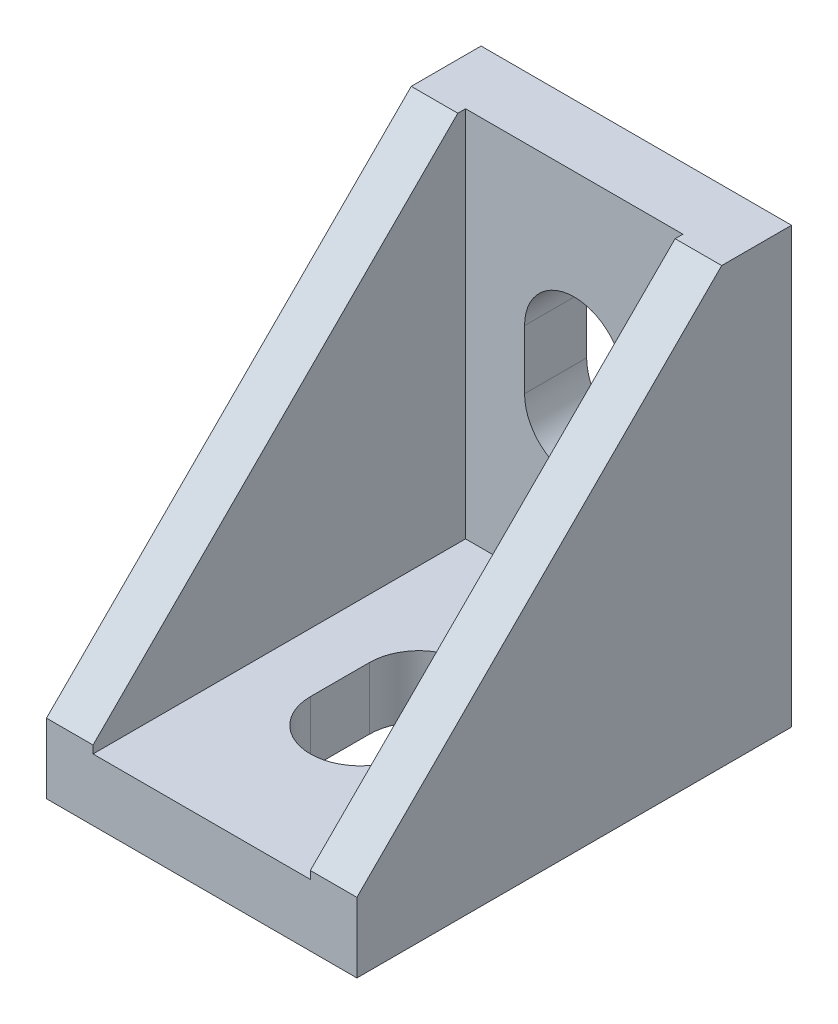
ISO-10303-21;
HEADER;
FILE_DESCRIPTION(('STEP AP214'),'2;1');
FILE_NAME('part.step','',(''),(''),'','','');
FILE_SCHEMA(('AUTOMOTIVE_DESIGN { 1 0 10303 214 1 1 1 1 }'));
ENDSEC;
DATA;
#1=APPLICATION_CONTEXT('core data for automotive mechanical design processes');
#2=APPLICATION_PROTOCOL_DEFINITION('international standard','automotive_design',2000,#1);
#3=PRODUCT_CONTEXT('',#1,'mechanical');
#4=PRODUCT('Part','Part','',(#3));
#5=PRODUCT_RELATED_PRODUCT_CATEGORY('part','',(#4));
#6=PRODUCT_DEFINITION_FORMATION('','',#4);
#7=PRODUCT_DEFINITION_CONTEXT('part definition',#1,'design');
#8=PRODUCT_DEFINITION('design','',#6,#7);
#9=PRODUCT_DEFINITION_SHAPE('','',#8);
#10=(LENGTH_UNIT() NAMED_UNIT(*) SI_UNIT(.MILLI.,.METRE.));
#11=(NAMED_UNIT(*) PLANE_ANGLE_UNIT() SI_UNIT($,.RADIAN.));
#12=(NAMED_UNIT(*) SI_UNIT($,.STERADIAN.) SOLID_ANGLE_UNIT());
#13=UNCERTAINTY_MEASURE_WITH_UNIT(LENGTH_MEASURE(1.E-05),#10,'distance_accuracy_value','');
#14=(GEOMETRIC_REPRESENTATION_CONTEXT(3) GLOBAL_UNCERTAINTY_ASSIGNED_CONTEXT((#13)) GLOBAL_UNIT_ASSIGNED_CONTEXT((#10,
#11,#12)) REPRESENTATION_CONTEXT('',''));
#15=CARTESIAN_POINT('',(0.,0.,0.));
#16=DIRECTION('',(0.,0.,1.));
#17=DIRECTION('',(1.,0.,0.));
#18=AXIS2_PLACEMENT_3D('',#15,#16,#17);
#19=CARTESIAN_POINT('',(10.,0.,28.));
#20=DIRECTION('',(0.,1.,0.));
#21=DIRECTION('',(0.,0.,1.));
#22=AXIS2_PLACEMENT_3D('',#19,#20,#21);
#23=PLANE('',#22);
#24=DIRECTION('',(0.,0.,-1.));
#25=VECTOR('',#24,1.);
#26=CARTESIAN_POINT('',(-10.,0.,28.));
#27=LINE('',#26,#25);
#28=CARTESIAN_POINT('',(-10.,0.,28.));
#29=VERTEX_POINT('',#28);
#30=CARTESIAN_POINT('',(-10.,0.,0.));
#31=VERTEX_POINT('',#30);
#32=EDGE_CURVE('E241',#29,#31,#27,.T.);
#33=ORIENTED_EDGE('',*,*,#32,.T.);
#34=DIRECTION('',(-1.,0.,0.));
#35=VECTOR('',#34,1.);
#36=CARTESIAN_POINT('',(10.,0.,0.));
#37=LINE('',#36,#35);
#38=CARTESIAN_POINT('',(10.,0.,0.));
#39=VERTEX_POINT('',#38);
#40=EDGE_CURVE('E257',#39,#31,#37,.T.);
#41=ORIENTED_EDGE('',*,*,#40,.F.);
#42=DIRECTION('',(0.,0.,-1.));
#43=VECTOR('',#42,1.);
#44=CARTESIAN_POINT('',(10.,0.,28.));
#45=LINE('',#44,#43);
#46=CARTESIAN_POINT('',(10.,0.,28.));
#47=VERTEX_POINT('',#46);
#48=EDGE_CURVE('E264',#47,#39,#45,.T.);
#49=ORIENTED_EDGE('',*,*,#48,.F.);
#50=DIRECTION('',(-1.,0.,0.));
#51=VECTOR('',#50,1.);
#52=CARTESIAN_POINT('',(10.,0.,28.));
#53=LINE('',#52,#51);
#54=EDGE_CURVE('E259',#47,#29,#53,.T.);
#55=ORIENTED_EDGE('',*,*,#54,.T.);
#56=EDGE_LOOP('',(#33,#41,#49,#55));
#57=FACE_BOUND('',#56,.T.);
#58=DIRECTION('',(-1.,0.,0.));
#59=VECTOR('',#58,1.);
#60=CARTESIAN_POINT('',(2.9,0.,4.5));
#61=LINE('',#60,#59);
#62=CARTESIAN_POINT('',(2.9,0.,4.5));
#63=VERTEX_POINT('',#62);
#64=CARTESIAN_POINT('',(-2.9,0.,4.5));
#65=VERTEX_POINT('',#64);
#66=EDGE_CURVE('E275',#63,#65,#61,.T.);
#67=ORIENTED_EDGE('',*,*,#66,.F.);
#68=DIRECTION('',(0.,0.,1.));
#69=VECTOR('',#68,1.);
#70=CARTESIAN_POINT('',(2.9,0.,3.));
#71=LINE('',#70,#69);
#72=CARTESIAN_POINT('',(2.9,0.,3.));
#73=VERTEX_POINT('',#72);
#74=EDGE_CURVE('E280',#73,#63,#71,.T.);
#75=ORIENTED_EDGE('',*,*,#74,.F.);
#76=DIRECTION('',(-1.,0.,0.));
#77=VECTOR('',#76,1.);
#78=CARTESIAN_POINT('',(2.9,0.,3.));
#79=LINE('',#78,#77);
#80=CARTESIAN_POINT('',(-2.9,0.,3.));
#81=VERTEX_POINT('',#80);
#82=EDGE_CURVE('E284',#73,#81,#79,.T.);
#83=ORIENTED_EDGE('',*,*,#82,.T.);
#84=DIRECTION('',(0.,0.,1.));
#85=VECTOR('',#84,1.);
#86=CARTESIAN_POINT('',(-2.9,0.,3.));
#87=LINE('',#86,#85);
#88=EDGE_CURVE('E289',#81,#65,#87,.T.);
#89=ORIENTED_EDGE('',*,*,#88,.T.);
#90=EDGE_LOOP('',(#67,#75,#83,#89));
#91=FACE_BOUND('',#90,.T.);
#92=DIRECTION('',(-1.,0.,0.));
#93=VECTOR('',#92,1.);
#94=CARTESIAN_POINT('',(2.9,0.,24.85));
#95=LINE('',#94,#93);
#96=CARTESIAN_POINT('',(2.9,0.,24.85));
#97=VERTEX_POINT('',#96);
#98=CARTESIAN_POINT('',(-2.9,0.,24.85));
#99=VERTEX_POINT('',#98);
#100=EDGE_CURVE('E294',#97,#99,#95,.T.);
#101=ORIENTED_EDGE('',*,*,#100,.F.);
#102=DIRECTION('',(0.,0.,1.));
#103=VECTOR('',#102,1.);
#104=CARTESIAN_POINT('',(2.9,0.,23.35));
#105=LINE('',#104,#103);
#106=CARTESIAN_POINT('',(2.9,0.,23.35));
#107=VERTEX_POINT('',#106);
#108=EDGE_CURVE('E299',#107,#97,#105,.T.);
#109=ORIENTED_EDGE('',*,*,#108,.F.);
#110=DIRECTION('',(-1.,0.,0.));
#111=VECTOR('',#110,1.);
#112=CARTESIAN_POINT('',(2.9,0.,23.35));
#113=LINE('',#112,#111);
#114=CARTESIAN_POINT('',(-2.9,0.,23.35));
#115=VERTEX_POINT('',#114);
#116=EDGE_CURVE('E303',#107,#115,#113,.T.);
#117=ORIENTED_EDGE('',*,*,#116,.T.);
#118=DIRECTION('',(0.,0.,1.));
#119=VECTOR('',#118,1.);
#120=CARTESIAN_POINT('',(-2.9,0.,23.35));
#121=LINE('',#120,#119);
#122=EDGE_CURVE('E308',#115,#99,#121,.T.);
#123=ORIENTED_EDGE('',*,*,#122,.T.);
#124=EDGE_LOOP('',(#101,#109,#117,#123));
#125=FACE_BOUND('',#124,.T.);
#126=CARTESIAN_POINT('',(0.,0.,14.));
#127=DIRECTION('',(0.,1.,0.));
#128=DIRECTION('',(1.,0.,0.));
#129=AXIS2_PLACEMENT_3D('',#126,#127,#128);
#130=CIRCLE('',#129,3.2);
#131=CARTESIAN_POINT('',(3.2,0.,14.));
#132=VERTEX_POINT('',#131);
#133=CARTESIAN_POINT('',(-3.2,0.,14.));
#134=VERTEX_POINT('',#133);
#135=EDGE_CURVE('E313',#132,#134,#130,.T.);
#136=ORIENTED_EDGE('',*,*,#135,.T.);
#137=DIRECTION('',(0.,0.,1.));
#138=VECTOR('',#137,1.);
#139=CARTESIAN_POINT('',(-3.2,0.,14.));
#140=LINE('',#139,#138);
#141=CARTESIAN_POINT('',(-3.2,0.,17.8));
#142=VERTEX_POINT('',#141);
#143=EDGE_CURVE('E318',#134,#142,#140,.T.);
#144=ORIENTED_EDGE('',*,*,#143,.T.);
#145=CARTESIAN_POINT('',(0.,0.,17.8));
#146=DIRECTION('',(0.,1.,0.));
#147=DIRECTION('',(-1.,0.,0.));
#148=AXIS2_PLACEMENT_3D('',#145,#146,#147);
#149=CIRCLE('',#148,3.2);
#150=CARTESIAN_POINT('',(3.2,0.,17.8));
#151=VERTEX_POINT('',#150);
#152=EDGE_CURVE('E323',#142,#151,#149,.T.);
#153=ORIENTED_EDGE('',*,*,#152,.T.);
#154=DIRECTION('',(0.,0.,-1.));
#155=VECTOR('',#154,1.);
#156=CARTESIAN_POINT('',(3.2,0.,17.8));
#157=LINE('',#156,#155);
#158=EDGE_CURVE('E328',#151,#132,#157,.T.);
#159=ORIENTED_EDGE('',*,*,#158,.T.);
#160=EDGE_LOOP('',(#136,#144,#153,#159));
#161=FACE_BOUND('',#160,.T.);
#162=ADVANCED_FACE('F17',(#57,#91,#125,#161),#23,.F.);
#163=CARTESIAN_POINT('',(7.,4.,28.));
#164=DIRECTION('',(0.,1.,0.));
#165=DIRECTION('',(0.,0.,1.));
#166=AXIS2_PLACEMENT_3D('',#163,#164,#165);
#167=PLANE('',#166);
#168=DIRECTION('',(0.,0.,-1.));
#169=VECTOR('',#168,1.);
#170=CARTESIAN_POINT('',(-7.,4.,28.));
#171=LINE('',#170,#169);
#172=CARTESIAN_POINT('',(-7.,4.,28.));
#173=VERTEX_POINT('',#172);
#174=CARTESIAN_POINT('',(-7.,4.,4.));
#175=VERTEX_POINT('',#174);
#176=EDGE_CURVE('E333',#173,#175,#171,.T.);
#177=ORIENTED_EDGE('',*,*,#176,.F.);
#178=DIRECTION('',(-1.,0.,0.));
#179=VECTOR('',#178,1.);
#180=CARTESIAN_POINT('',(7.,4.,28.));
#181=LINE('',#180,#179);
#182=CARTESIAN_POINT('',(7.,4.,28.));
#183=VERTEX_POINT('',#182);
#184=EDGE_CURVE('E338',#183,#173,#181,.T.);
#185=ORIENTED_EDGE('',*,*,#184,.F.);
#186=DIRECTION('',(0.,0.,-1.));
#187=VECTOR('',#186,1.);
#188=CARTESIAN_POINT('',(7.,4.,28.));
#189=LINE('',#188,#187);
#190=CARTESIAN_POINT('',(7.,4.,4.));
#191=VERTEX_POINT('',#190);
#192=EDGE_CURVE('E343',#183,#191,#189,.T.);
#193=ORIENTED_EDGE('',*,*,#192,.T.);
#194=DIRECTION('',(-1.,0.,0.));
#195=VECTOR('',#194,1.);
#196=CARTESIAN_POINT('',(7.,4.,4.));
#197=LINE('',#196,#195);
#198=EDGE_CURVE('E348',#191,#175,#197,.T.);
#199=ORIENTED_EDGE('',*,*,#198,.T.);
#200=EDGE_LOOP('',(#177,#185,#193,#199));
#201=FACE_BOUND('',#200,.T.);
#202=DIRECTION('',(0.,0.,1.));
#203=VECTOR('',#202,1.);
#204=CARTESIAN_POINT('',(-3.2,4.,14.));
#205=LINE('',#204,#203);
#206=CARTESIAN_POINT('',(-3.2,4.,14.));
#207=VERTEX_POINT('',#206);
#208=CARTESIAN_POINT('',(-3.2,4.,17.8));
#209=VERTEX_POINT('',#208);
#210=EDGE_CURVE('E353',#207,#209,#205,.T.);
#211=ORIENTED_EDGE('',*,*,#210,.F.);
#212=CARTESIAN_POINT('',(0.,4.,14.));
#213=DIRECTION('',(0.,1.,0.));
#214=DIRECTION('',(1.,0.,0.));
#215=AXIS2_PLACEMENT_3D('',#212,#213,#214);
#216=CIRCLE('',#215,3.2);
#217=CARTESIAN_POINT('',(3.2,4.,14.));
#218=VERTEX_POINT('',#217);
#219=EDGE_CURVE('E358',#218,#207,#216,.T.);
#220=ORIENTED_EDGE('',*,*,#219,.F.);
#221=DIRECTION('',(0.,0.,-1.));
#222=VECTOR('',#221,1.);
#223=CARTESIAN_POINT('',(3.2,4.,17.8));
#224=LINE('',#223,#222);
#225=CARTESIAN_POINT('',(3.2,4.,17.8));
#226=VERTEX_POINT('',#225);
#227=EDGE_CURVE('E363',#226,#218,#224,.T.);
#228=ORIENTED_EDGE('',*,*,#227,.F.);
#229=CARTESIAN_POINT('',(0.,4.,17.8));
#230=DIRECTION('',(0.,1.,0.));
#231=DIRECTION('',(-1.,0.,0.));
#232=AXIS2_PLACEMENT_3D('',#229,#230,#231);
#233=CIRCLE('',#232,3.2);
#234=EDGE_CURVE('E367',#209,#226,#233,.T.);
#235=ORIENTED_EDGE('',*,*,#234,.F.);
#236=EDGE_LOOP('',(#211,#220,#228,#235));
#237=FACE_BOUND('',#236,.T.);
#238=ADVANCED_FACE('F729',(#201,#237),#167,.T.);
#239=CARTESIAN_POINT('',(10.,28.,4.5));
#240=DIRECTION('',(0.,-0.707106781186548,-0.707106781186548));
#241=DIRECTION('',(0.,0.707106781186548,-0.707106781186548));
#242=AXIS2_PLACEMENT_3D('',#239,#240,#241);
#243=PLANE('',#242);
#244=DIRECTION('',(0.,-0.707106781186548,0.707106781186548));
#245=VECTOR('',#244,1.);
#246=CARTESIAN_POINT('',(-7.,28.,4.5));
#247=LINE('',#246,#245);
#248=CARTESIAN_POINT('',(-7.,28.,4.5));
#249=VERTEX_POINT('',#248);
#250=CARTESIAN_POINT('',(-7.,4.5,28.));
#251=VERTEX_POINT('',#250);
#252=EDGE_CURVE('E372',#249,#251,#247,.T.);
#253=ORIENTED_EDGE('',*,*,#252,.F.);
#254=DIRECTION('',(-1.,0.,0.));
#255=VECTOR('',#254,1.);
#256=CARTESIAN_POINT('',(-7.,28.,4.5));
#257=LINE('',#256,#255);
#258=CARTESIAN_POINT('',(-10.,28.,4.5));
#259=VERTEX_POINT('',#258);
#260=EDGE_CURVE('E376',#249,#259,#257,.T.);
#261=ORIENTED_EDGE('',*,*,#260,.T.);
#262=DIRECTION('',(0.,-0.707106781186548,0.707106781186548));
#263=VECTOR('',#262,1.);
#264=CARTESIAN_POINT('',(-10.,28.,4.5));
#265=LINE('',#264,#263);
#266=CARTESIAN_POINT('',(-10.,4.5,28.));
#267=VERTEX_POINT('',#266);
#268=EDGE_CURVE('E381',#259,#267,#265,.T.);
#269=ORIENTED_EDGE('',*,*,#268,.T.);
#270=DIRECTION('',(-1.,0.,0.));
#271=VECTOR('',#270,1.);
#272=CARTESIAN_POINT('',(-7.,4.5,28.));
#273=LINE('',#272,#271);
#274=EDGE_CURVE('E386',#251,#267,#273,.T.);
#275=ORIENTED_EDGE('',*,*,#274,.F.);
#276=EDGE_LOOP('',(#253,#261,#269,#275));
#277=FACE_BOUND('',#276,.T.);
#278=ADVANCED_FACE('F743',(#277),#243,.F.);
#279=DIRECTION('',(-1.,0.,0.));
#280=VECTOR('',#279,1.);
#281=CARTESIAN_POINT('',(10.,28.,4.5));
#282=LINE('',#281,#280);
#283=CARTESIAN_POINT('',(10.,28.,4.5));
#284=VERTEX_POINT('',#283);
#285=CARTESIAN_POINT('',(7.,28.,4.5));
#286=VERTEX_POINT('',#285);
#287=EDGE_CURVE('E391',#284,#286,#282,.T.);
#288=ORIENTED_EDGE('',*,*,#287,.T.);
#289=DIRECTION('',(0.,-0.707106781186548,0.707106781186548));
#290=VECTOR('',#289,1.);
#291=CARTESIAN_POINT('',(7.,28.,4.5));
#292=LINE('',#291,#290);
#293=CARTESIAN_POINT('',(7.,4.5,28.));
#294=VERTEX_POINT('',#293);
#295=EDGE_CURVE('E396',#286,#294,#292,.T.);
#296=ORIENTED_EDGE('',*,*,#295,.T.);
#297=DIRECTION('',(-1.,0.,0.));
#298=VECTOR('',#297,1.);
#299=CARTESIAN_POINT('',(10.,4.5,28.));
#300=LINE('',#299,#298);
#301=CARTESIAN_POINT('',(10.,4.5,28.));
#302=VERTEX_POINT('',#301);
#303=EDGE_CURVE('E401',#302,#294,#300,.T.);
#304=ORIENTED_EDGE('',*,*,#303,.F.);
#305=DIRECTION('',(0.,-0.707106781186548,0.707106781186548));
#306=VECTOR('',#305,1.);
#307=CARTESIAN_POINT('',(10.,28.,4.5));
#308=LINE('',#307,#306);
#309=EDGE_CURVE('E406',#284,#302,#308,.T.);
#310=ORIENTED_EDGE('',*,*,#309,.F.);
#311=EDGE_LOOP('',(#288,#296,#304,#310));
#312=FACE_BOUND('',#311,.T.);
#313=ADVANCED_FACE('F749',(#312),#243,.F.);
#314=CARTESIAN_POINT('',(10.,4.5,28.));
#315=DIRECTION('',(0.,0.,-1.));
#316=DIRECTION('',(-1.,0.,0.));
#317=AXIS2_PLACEMENT_3D('',#314,#315,#316);
#318=PLANE('',#317);
#319=ORIENTED_EDGE('',*,*,#303,.T.);
#320=DIRECTION('',(0.,-1.,0.));
#321=VECTOR('',#320,1.);
#322=CARTESIAN_POINT('',(7.,4.5,28.));
#323=LINE('',#322,#321);
#324=EDGE_CURVE('E410',#294,#183,#323,.T.);
#325=ORIENTED_EDGE('',*,*,#324,.T.);
#326=ORIENTED_EDGE('',*,*,#184,.T.);
#327=DIRECTION('',(0.,-1.,0.));
#328=VECTOR('',#327,1.);
#329=CARTESIAN_POINT('',(-7.,4.5,28.));
#330=LINE('',#329,#328);
#331=EDGE_CURVE('E415',#251,#173,#330,.T.);
#332=ORIENTED_EDGE('',*,*,#331,.F.);
#333=ORIENTED_EDGE('',*,*,#274,.T.);
#334=DIRECTION('',(0.,-1.,0.));
#335=VECTOR('',#334,1.);
#336=CARTESIAN_POINT('',(-10.,4.5,28.));
#337=LINE('',#336,#335);
#338=EDGE_CURVE('E419',#267,#29,#337,.T.);
#339=ORIENTED_EDGE('',*,*,#338,.T.);
#340=ORIENTED_EDGE('',*,*,#54,.F.);
#341=DIRECTION('',(0.,-1.,0.));
#342=VECTOR('',#341,1.);
#343=CARTESIAN_POINT('',(10.,4.5,28.));
#344=LINE('',#343,#342);
#345=EDGE_CURVE('E423',#302,#47,#344,.T.);
#346=ORIENTED_EDGE('',*,*,#345,.F.);
#347=EDGE_LOOP('',(#319,#325,#326,#332,#333,#339,#340,#346));
#348=FACE_BOUND('',#347,.T.);
#349=ADVANCED_FACE('F751',(#348),#318,.F.);
#350=CARTESIAN_POINT('',(10.,0.,0.));
#351=DIRECTION('',(0.,0.,1.));
#352=DIRECTION('',(1.,0.,0.));
#353=AXIS2_PLACEMENT_3D('',#350,#351,#352);
#354=PLANE('',#353);
#355=DIRECTION('',(0.,-1.,0.));
#356=VECTOR('',#355,1.);
#357=CARTESIAN_POINT('',(-3.2,17.8,0.));
#358=LINE('',#357,#356);
#359=CARTESIAN_POINT('',(-3.2,17.8,0.));
#360=VERTEX_POINT('',#359);
#361=CARTESIAN_POINT('',(-3.2,14.,0.));
#362=VERTEX_POINT('',#361);
#363=EDGE_CURVE('E427',#360,#362,#358,.T.);
#364=ORIENTED_EDGE('',*,*,#363,.T.);
#365=CARTESIAN_POINT('',(0.,14.,0.));
#366=DIRECTION('',(0.,0.,1.));
#367=DIRECTION('',(-1.,0.,0.));
#368=AXIS2_PLACEMENT_3D('',#365,#366,#367);
#369=CIRCLE('',#368,3.2);
#370=CARTESIAN_POINT('',(3.2,14.,0.));
#371=VERTEX_POINT('',#370);
#372=EDGE_CURVE('E432',#362,#371,#369,.T.);
#373=ORIENTED_EDGE('',*,*,#372,.T.);
#374=DIRECTION('',(0.,1.,0.));
#375=VECTOR('',#374,1.);
#376=CARTESIAN_POINT('',(3.2,14.,0.));
#377=LINE('',#376,#375);
#378=CARTESIAN_POINT('',(3.2,17.8,0.));
#379=VERTEX_POINT('',#378);
#380=EDGE_CURVE('E437',#371,#379,#377,.T.);
#381=ORIENTED_EDGE('',*,*,#380,.T.);
#382=CARTESIAN_POINT('',(0.,17.799999915706,0.));
#383=DIRECTION('',(0.,0.,1.));
#384=DIRECTION('',(1.,2.63418753476685E-08,0.));
#385=AXIS2_PLACEMENT_3D('',#382,#383,#384);
#386=CIRCLE('',#385,3.2);
#387=EDGE_CURVE('E442',#379,#360,#386,.T.);
#388=ORIENTED_EDGE('',*,*,#387,.T.);
#389=EDGE_LOOP('',(#364,#373,#381,#388));
#390=FACE_BOUND('',#389,.T.);
#391=DIRECTION('',(-1.,0.,0.));
#392=VECTOR('',#391,1.);
#393=CARTESIAN_POINT('',(2.9,23.35,0.));
#394=LINE('',#393,#392);
#395=CARTESIAN_POINT('',(2.9,23.35,0.));
#396=VERTEX_POINT('',#395);
#397=CARTESIAN_POINT('',(-2.9,23.35,0.));
#398=VERTEX_POINT('',#397);
#399=EDGE_CURVE('E447',#396,#398,#394,.T.);
#400=ORIENTED_EDGE('',*,*,#399,.F.);
#401=DIRECTION('',(0.,-1.,0.));
#402=VECTOR('',#401,1.);
#403=CARTESIAN_POINT('',(2.9,24.85,0.));
#404=LINE('',#403,#402);
#405=CARTESIAN_POINT('',(2.9,24.85,0.));
#406=VERTEX_POINT('',#405);
#407=EDGE_CURVE('E452',#406,#396,#404,.T.);
#408=ORIENTED_EDGE('',*,*,#407,.F.);
#409=DIRECTION('',(-1.,0.,0.));
#410=VECTOR('',#409,1.);
#411=CARTESIAN_POINT('',(2.9,24.85,0.));
#412=LINE('',#411,#410);
#413=CARTESIAN_POINT('',(-2.9,24.85,0.));
#414=VERTEX_POINT('',#413);
#415=EDGE_CURVE('E456',#406,#414,#412,.T.);
#416=ORIENTED_EDGE('',*,*,#415,.T.);
#417=DIRECTION('',(0.,-1.,0.));
#418=VECTOR('',#417,1.);
#419=CARTESIAN_POINT('',(-2.9,24.85,0.));
#420=LINE('',#419,#418);
#421=EDGE_CURVE('E461',#414,#398,#420,.T.);
#422=ORIENTED_EDGE('',*,*,#421,.T.);
#423=EDGE_LOOP('',(#400,#408,#416,#422));
#424=FACE_BOUND('',#423,.T.);
#425=DIRECTION('',(-1.,0.,0.));
#426=VECTOR('',#425,1.);
#427=CARTESIAN_POINT('',(2.9,3.,0.));
#428=LINE('',#427,#426);
#429=CARTESIAN_POINT('',(2.9,3.,0.));
#430=VERTEX_POINT('',#429);
#431=CARTESIAN_POINT('',(-2.9,3.,0.));
#432=VERTEX_POINT('',#431);
#433=EDGE_CURVE('E466',#430,#432,#428,.T.);
#434=ORIENTED_EDGE('',*,*,#433,.F.);
#435=DIRECTION('',(0.,-1.,0.));
#436=VECTOR('',#435,1.);
#437=CARTESIAN_POINT('',(2.9,4.5,0.));
#438=LINE('',#437,#436);
#439=CARTESIAN_POINT('',(2.9,4.5,0.));
#440=VERTEX_POINT('',#439);
#441=EDGE_CURVE('E471',#440,#430,#438,.T.);
#442=ORIENTED_EDGE('',*,*,#441,.F.);
#443=DIRECTION('',(-1.,0.,0.));
#444=VECTOR('',#443,1.);
#445=CARTESIAN_POINT('',(2.9,4.5,0.));
#446=LINE('',#445,#444);
#447=CARTESIAN_POINT('',(-2.9,4.5,0.));
#448=VERTEX_POINT('',#447);
#449=EDGE_CURVE('E475',#440,#448,#446,.T.);
#450=ORIENTED_EDGE('',*,*,#449,.T.);
#451=DIRECTION('',(0.,-1.,0.));
#452=VECTOR('',#451,1.);
#453=CARTESIAN_POINT('',(-2.9,4.5,0.));
#454=LINE('',#453,#452);
#455=EDGE_CURVE('E250',#448,#432,#454,.T.);
#456=ORIENTED_EDGE('',*,*,#455,.T.);
#457=EDGE_LOOP('',(#434,#442,#450,#456));
#458=FACE_BOUND('',#457,.T.);
#459=DIRECTION('',(0.,1.,0.));
#460=VECTOR('',#459,1.);
#461=CARTESIAN_POINT('',(-10.,0.,0.));
#462=LINE('',#461,#460);
#463=CARTESIAN_POINT('',(-10.,28.,0.));
#464=VERTEX_POINT('',#463);
#465=EDGE_CURVE('E238',#31,#464,#462,.T.);
#466=ORIENTED_EDGE('',*,*,#465,.T.);
#467=DIRECTION('',(-1.,0.,0.));
#468=VECTOR('',#467,1.);
#469=CARTESIAN_POINT('',(10.,28.,0.));
#470=LINE('',#469,#468);
#471=CARTESIAN_POINT('',(10.,28.,0.));
#472=VERTEX_POINT('',#471);
#473=EDGE_CURVE('E249',#472,#464,#470,.T.);
#474=ORIENTED_EDGE('',*,*,#473,.F.);
#475=DIRECTION('',(0.,1.,0.));
#476=VECTOR('',#475,1.);
#477=CARTESIAN_POINT('',(10.,0.,0.));
#478=LINE('',#477,#476);
#479=EDGE_CURVE('E263',#39,#472,#478,.T.);
#480=ORIENTED_EDGE('',*,*,#479,.F.);
#481=ORIENTED_EDGE('',*,*,#40,.T.);
#482=EDGE_LOOP('',(#466,#474,#480,#481));
#483=FACE_BOUND('',#482,.T.);
#484=ADVANCED_FACE('F262',(#390,#424,#458,#483),#354,.F.);
#485=CARTESIAN_POINT('',(10.,28.,0.));
#486=DIRECTION('',(0.,-1.,0.));
#487=DIRECTION('',(0.,0.,-1.));
#488=AXIS2_PLACEMENT_3D('',#485,#486,#487);
#489=PLANE('',#488);
#490=DIRECTION('',(-1.,0.,0.));
#491=VECTOR('',#490,1.);
#492=CARTESIAN_POINT('',(7.,28.,4.));
#493=LINE('',#492,#491);
#494=CARTESIAN_POINT('',(7.,28.,4.));
#495=VERTEX_POINT('',#494);
#496=CARTESIAN_POINT('',(-7.,28.,4.));
#497=VERTEX_POINT('',#496);
#498=EDGE_CURVE('E492',#495,#497,#493,.T.);
#499=ORIENTED_EDGE('',*,*,#498,.F.);
#500=DIRECTION('',(0.,0.,1.));
#501=VECTOR('',#500,1.);
#502=CARTESIAN_POINT('',(7.,28.,4.));
#503=LINE('',#502,#501);
#504=EDGE_CURVE('E496',#495,#286,#503,.T.);
#505=ORIENTED_EDGE('',*,*,#504,.T.);
#506=ORIENTED_EDGE('',*,*,#287,.F.);
#507=DIRECTION('',(0.,0.,1.));
#508=VECTOR('',#507,1.);
#509=CARTESIAN_POINT('',(10.,28.,0.));
#510=LINE('',#509,#508);
#511=EDGE_CURVE('E501',#472,#284,#510,.T.);
#512=ORIENTED_EDGE('',*,*,#511,.F.);
#513=ORIENTED_EDGE('',*,*,#473,.T.);
#514=DIRECTION('',(0.,0.,1.));
#515=VECTOR('',#514,1.);
#516=CARTESIAN_POINT('',(-10.,28.,0.));
#517=LINE('',#516,#515);
#518=EDGE_CURVE('E244',#464,#259,#517,.T.);
#519=ORIENTED_EDGE('',*,*,#518,.T.);
#520=ORIENTED_EDGE('',*,*,#260,.F.);
#521=DIRECTION('',(0.,0.,1.));
#522=VECTOR('',#521,1.);
#523=CARTESIAN_POINT('',(-7.,28.,4.));
#524=LINE('',#523,#522);
#525=EDGE_CURVE('E508',#497,#249,#524,.T.);
#526=ORIENTED_EDGE('',*,*,#525,.F.);
#527=EDGE_LOOP('',(#499,#505,#506,#512,#513,#519,#520,#526));
#528=FACE_BOUND('',#527,.T.);
#529=ADVANCED_FACE('F757',(#528),#489,.F.);
#530=CARTESIAN_POINT('',(10.,0.,0.));
#531=DIRECTION('',(1.,0.,0.));
#532=DIRECTION('',(0.,0.,-1.));
#533=AXIS2_PLACEMENT_3D('',#530,#531,#532);
#534=PLANE('',#533);
#535=ORIENTED_EDGE('',*,*,#309,.T.);
#536=ORIENTED_EDGE('',*,*,#345,.T.);
#537=ORIENTED_EDGE('',*,*,#48,.T.);
#538=ORIENTED_EDGE('',*,*,#479,.T.);
#539=ORIENTED_EDGE('',*,*,#511,.T.);
#540=EDGE_LOOP('',(#535,#536,#537,#538,#539));
#541=FACE_BOUND('',#540,.T.);
#542=ADVANCED_FACE('F761',(#541),#534,.T.);
#543=CARTESIAN_POINT('',(-10.,0.,0.));
#544=DIRECTION('',(1.,0.,0.));
#545=DIRECTION('',(0.,0.,-1.));
#546=AXIS2_PLACEMENT_3D('',#543,#544,#545);
#547=PLANE('',#546);
#548=ORIENTED_EDGE('',*,*,#268,.F.);
#549=ORIENTED_EDGE('',*,*,#518,.F.);
#550=ORIENTED_EDGE('',*,*,#465,.F.);
#551=ORIENTED_EDGE('',*,*,#32,.F.);
#552=ORIENTED_EDGE('',*,*,#338,.F.);
#553=EDGE_LOOP('',(#548,#549,#550,#551,#552));
#554=FACE_BOUND('',#553,.T.);
#555=ADVANCED_FACE('F240',(#554),#547,.F.);
#556=CARTESIAN_POINT('',(7.,0.,0.));
#557=DIRECTION('',(1.,0.,0.));
#558=DIRECTION('',(0.,0.,-1.));
#559=AXIS2_PLACEMENT_3D('',#556,#557,#558);
#560=PLANE('',#559);
#561=ORIENTED_EDGE('',*,*,#504,.F.);
#562=DIRECTION('',(0.,1.,0.));
#563=VECTOR('',#562,1.);
#564=CARTESIAN_POINT('',(7.,4.,4.));
#565=LINE('',#564,#563);
#566=EDGE_CURVE('E512',#191,#495,#565,.T.);
#567=ORIENTED_EDGE('',*,*,#566,.F.);
#568=ORIENTED_EDGE('',*,*,#192,.F.);
#569=ORIENTED_EDGE('',*,*,#324,.F.);
#570=ORIENTED_EDGE('',*,*,#295,.F.);
#571=EDGE_LOOP('',(#561,#567,#568,#569,#570));
#572=FACE_BOUND('',#571,.T.);
#573=ADVANCED_FACE('F768',(#572),#560,.F.);
#574=CARTESIAN_POINT('',(-7.,0.,0.));
#575=DIRECTION('',(1.,0.,0.));
#576=DIRECTION('',(0.,0.,-1.));
#577=AXIS2_PLACEMENT_3D('',#574,#575,#576);
#578=PLANE('',#577);
#579=ORIENTED_EDGE('',*,*,#252,.T.);
#580=ORIENTED_EDGE('',*,*,#331,.T.);
#581=ORIENTED_EDGE('',*,*,#176,.T.);
#582=DIRECTION('',(0.,1.,0.));
#583=VECTOR('',#582,1.);
#584=CARTESIAN_POINT('',(-7.,4.,4.));
#585=LINE('',#584,#583);
#586=EDGE_CURVE('E516',#175,#497,#585,.T.);
#587=ORIENTED_EDGE('',*,*,#586,.T.);
#588=ORIENTED_EDGE('',*,*,#525,.T.);
#589=EDGE_LOOP('',(#579,#580,#581,#587,#588));
#590=FACE_BOUND('',#589,.T.);
#591=ADVANCED_FACE('F771',(#590),#578,.T.);
#592=CARTESIAN_POINT('',(7.,4.,4.));
#593=DIRECTION('',(0.,0.,1.));
#594=DIRECTION('',(1.,0.,0.));
#595=AXIS2_PLACEMENT_3D('',#592,#593,#594);
#596=PLANE('',#595);
#597=CARTESIAN_POINT('',(0.,14.,4.));
#598=DIRECTION('',(0.,0.,1.));
#599=DIRECTION('',(-1.,0.,0.));
#600=AXIS2_PLACEMENT_3D('',#597,#598,#599);
#601=CIRCLE('',#600,3.2);
#602=CARTESIAN_POINT('',(-3.2,14.,4.));
#603=VERTEX_POINT('',#602);
#604=CARTESIAN_POINT('',(3.2,14.,4.));
#605=VERTEX_POINT('',#604);
#606=EDGE_CURVE('E521',#603,#605,#601,.T.);
#607=ORIENTED_EDGE('',*,*,#606,.F.);
#608=DIRECTION('',(0.,-1.,0.));
#609=VECTOR('',#608,1.);
#610=CARTESIAN_POINT('',(-3.2,17.8,4.));
#611=LINE('',#610,#609);
#612=CARTESIAN_POINT('',(-3.2,17.8,4.));
#613=VERTEX_POINT('',#612);
#614=EDGE_CURVE('E526',#613,#603,#611,.T.);
#615=ORIENTED_EDGE('',*,*,#614,.F.);
#616=CARTESIAN_POINT('',(0.,17.799999915706,4.));
#617=DIRECTION('',(0.,0.,1.));
#618=DIRECTION('',(1.,0.,0.));
#619=AXIS2_PLACEMENT_3D('',#616,#617,#618);
#620=CIRCLE('',#619,3.2);
#621=CARTESIAN_POINT('',(3.2,17.799999915706,4.));
#622=VERTEX_POINT('',#621);
#623=EDGE_CURVE('E531',#622,#613,#620,.T.);
#624=ORIENTED_EDGE('',*,*,#623,.F.);
#625=DIRECTION('',(0.,1.,0.));
#626=VECTOR('',#625,1.);
#627=CARTESIAN_POINT('',(3.2,14.,4.));
#628=LINE('',#627,#626);
#629=EDGE_CURVE('E535',#605,#622,#628,.T.);
#630=ORIENTED_EDGE('',*,*,#629,.F.);
#631=EDGE_LOOP('',(#607,#615,#624,#630));
#632=FACE_BOUND('',#631,.T.);
#633=ORIENTED_EDGE('',*,*,#586,.F.);
#634=ORIENTED_EDGE('',*,*,#198,.F.);
#635=ORIENTED_EDGE('',*,*,#566,.T.);
#636=ORIENTED_EDGE('',*,*,#498,.T.);
#637=EDGE_LOOP('',(#633,#634,#635,#636));
#638=FACE_BOUND('',#637,.T.);
#639=ADVANCED_FACE('F775',(#632,#638),#596,.T.);
#640=CARTESIAN_POINT('',(2.9,0.,4.5));
#641=DIRECTION('',(0.,0.,-1.));
#642=DIRECTION('',(-1.,0.,0.));
#643=AXIS2_PLACEMENT_3D('',#640,#641,#642);
#644=PLANE('',#643);
#645=DIRECTION('',(0.,-1.,0.));
#646=VECTOR('',#645,1.);
#647=CARTESIAN_POINT('',(-2.9,0.,4.5));
#648=LINE('',#647,#646);
#649=CARTESIAN_POINT('',(-2.9,-1.7,4.5));
#650=VERTEX_POINT('',#649);
#651=EDGE_CURVE('E540',#65,#650,#648,.T.);
#652=ORIENTED_EDGE('',*,*,#651,.T.);
#653=DIRECTION('',(-1.,0.,0.));
#654=VECTOR('',#653,1.);
#655=CARTESIAN_POINT('',(2.9,-1.7,4.5));
#656=LINE('',#655,#654);
#657=CARTESIAN_POINT('',(2.9,-1.7,4.5));
#658=VERTEX_POINT('',#657);
#659=EDGE_CURVE('E545',#658,#650,#656,.T.);
#660=ORIENTED_EDGE('',*,*,#659,.F.);
#661=DIRECTION('',(0.,-1.,0.));
#662=VECTOR('',#661,1.);
#663=CARTESIAN_POINT('',(2.9,0.,4.5));
#664=LINE('',#663,#662);
#665=EDGE_CURVE('E550',#63,#658,#664,.T.);
#666=ORIENTED_EDGE('',*,*,#665,.F.);
#667=ORIENTED_EDGE('',*,*,#66,.T.);
#668=EDGE_LOOP('',(#652,#660,#666,#667));
#669=FACE_BOUND('',#668,.T.);
#670=ADVANCED_FACE('F779',(#669),#644,.F.);
#671=CARTESIAN_POINT('',(2.9,-1.7,4.5));
#672=DIRECTION('',(0.,1.,0.));
#673=DIRECTION('',(0.,0.,1.));
#674=AXIS2_PLACEMENT_3D('',#671,#672,#673);
#675=PLANE('',#674);
#676=DIRECTION('',(0.,0.,-1.));
#677=VECTOR('',#676,1.);
#678=CARTESIAN_POINT('',(-2.9,-1.7,4.5));
#679=LINE('',#678,#677);
#680=CARTESIAN_POINT('',(-2.9,-1.7,3.));
#681=VERTEX_POINT('',#680);
#682=EDGE_CURVE('E554',#650,#681,#679,.T.);
#683=ORIENTED_EDGE('',*,*,#682,.T.);
#684=DIRECTION('',(-1.,0.,0.));
#685=VECTOR('',#684,1.);
#686=CARTESIAN_POINT('',(2.9,-1.7,3.));
#687=LINE('',#686,#685);
#688=CARTESIAN_POINT('',(2.9,-1.7,3.));
#689=VERTEX_POINT('',#688);
#690=EDGE_CURVE('E559',#689,#681,#687,.T.);
#691=ORIENTED_EDGE('',*,*,#690,.F.);
#692=DIRECTION('',(0.,0.,-1.));
#693=VECTOR('',#692,1.);
#694=CARTESIAN_POINT('',(2.9,-1.7,4.5));
#695=LINE('',#694,#693);
#696=EDGE_CURVE('E564',#658,#689,#695,.T.);
#697=ORIENTED_EDGE('',*,*,#696,.F.);
#698=ORIENTED_EDGE('',*,*,#659,.T.);
#699=EDGE_LOOP('',(#683,#691,#697,#698));
#700=FACE_BOUND('',#699,.T.);
#701=ADVANCED_FACE('F783',(#700),#675,.F.);
#702=CARTESIAN_POINT('',(2.9,-1.7,3.));
#703=DIRECTION('',(0.,0.,1.));
#704=DIRECTION('',(1.,0.,0.));
#705=AXIS2_PLACEMENT_3D('',#702,#703,#704);
#706=PLANE('',#705);
#707=DIRECTION('',(0.,1.,0.));
#708=VECTOR('',#707,1.);
#709=CARTESIAN_POINT('',(-2.9,-1.7,3.));
#710=LINE('',#709,#708);
#711=EDGE_CURVE('E568',#681,#81,#710,.T.);
#712=ORIENTED_EDGE('',*,*,#711,.T.);
#713=ORIENTED_EDGE('',*,*,#82,.F.);
#714=DIRECTION('',(0.,1.,0.));
#715=VECTOR('',#714,1.);
#716=CARTESIAN_POINT('',(2.9,-1.7,3.));
#717=LINE('',#716,#715);
#718=EDGE_CURVE('E573',#689,#73,#717,.T.);
#719=ORIENTED_EDGE('',*,*,#718,.F.);
#720=ORIENTED_EDGE('',*,*,#690,.T.);
#721=EDGE_LOOP('',(#712,#713,#719,#720));
#722=FACE_BOUND('',#721,.T.);
#723=ADVANCED_FACE('F787',(#722),#706,.F.);
#724=CARTESIAN_POINT('',(2.9,0.,0.));
#725=DIRECTION('',(1.,0.,0.));
#726=DIRECTION('',(0.,0.,-1.));
#727=AXIS2_PLACEMENT_3D('',#724,#725,#726);
#728=PLANE('',#727);
#729=ORIENTED_EDGE('',*,*,#74,.T.);
#730=ORIENTED_EDGE('',*,*,#665,.T.);
#731=ORIENTED_EDGE('',*,*,#696,.T.);
#732=ORIENTED_EDGE('',*,*,#718,.T.);
#733=EDGE_LOOP('',(#729,#730,#731,#732));
#734=FACE_BOUND('',#733,.T.);
#735=ADVANCED_FACE('F791',(#734),#728,.T.);
#736=CARTESIAN_POINT('',(-2.9,0.,0.));
#737=DIRECTION('',(1.,0.,0.));
#738=DIRECTION('',(0.,0.,-1.));
#739=AXIS2_PLACEMENT_3D('',#736,#737,#738);
#740=PLANE('',#739);
#741=ORIENTED_EDGE('',*,*,#88,.F.);
#742=ORIENTED_EDGE('',*,*,#711,.F.);
#743=ORIENTED_EDGE('',*,*,#682,.F.);
#744=ORIENTED_EDGE('',*,*,#651,.F.);
#745=EDGE_LOOP('',(#741,#742,#743,#744));
#746=FACE_BOUND('',#745,.T.);
#747=ADVANCED_FACE('F795',(#746),#740,.F.);
#748=CARTESIAN_POINT('',(2.9,0.,24.85));
#749=DIRECTION('',(0.,0.,-1.));
#750=DIRECTION('',(-1.,0.,0.));
#751=AXIS2_PLACEMENT_3D('',#748,#749,#750);
#752=PLANE('',#751);
#753=DIRECTION('',(0.,-1.,0.));
#754=VECTOR('',#753,1.);
#755=CARTESIAN_POINT('',(-2.9,0.,24.85));
#756=LINE('',#755,#754);
#757=CARTESIAN_POINT('',(-2.9,-1.7,24.85));
#758=VERTEX_POINT('',#757);
#759=EDGE_CURVE('E577',#99,#758,#756,.T.);
#760=ORIENTED_EDGE('',*,*,#759,.T.);
#761=DIRECTION('',(-1.,0.,0.));
#762=VECTOR('',#761,1.);
#763=CARTESIAN_POINT('',(2.9,-1.7,24.85));
#764=LINE('',#763,#762);
#765=CARTESIAN_POINT('',(2.9,-1.7,24.85));
#766=VERTEX_POINT('',#765);
#767=EDGE_CURVE('E582',#766,#758,#764,.T.);
#768=ORIENTED_EDGE('',*,*,#767,.F.);
#769=DIRECTION('',(0.,-1.,0.));
#770=VECTOR('',#769,1.);
#771=CARTESIAN_POINT('',(2.9,0.,24.85));
#772=LINE('',#771,#770);
#773=EDGE_CURVE('E587',#97,#766,#772,.T.);
#774=ORIENTED_EDGE('',*,*,#773,.F.);
#775=ORIENTED_EDGE('',*,*,#100,.T.);
#776=EDGE_LOOP('',(#760,#768,#774,#775));
#777=FACE_BOUND('',#776,.T.);
#778=ADVANCED_FACE('F799',(#777),#752,.F.);
#779=CARTESIAN_POINT('',(2.9,-1.7,24.85));
#780=DIRECTION('',(0.,1.,0.));
#781=DIRECTION('',(0.,0.,1.));
#782=AXIS2_PLACEMENT_3D('',#779,#780,#781);
#783=PLANE('',#782);
#784=DIRECTION('',(0.,0.,-1.));
#785=VECTOR('',#784,1.);
#786=CARTESIAN_POINT('',(-2.9,-1.7,24.85));
#787=LINE('',#786,#785);
#788=CARTESIAN_POINT('',(-2.9,-1.7,23.35));
#789=VERTEX_POINT('',#788);
#790=EDGE_CURVE('E591',#758,#789,#787,.T.);
#791=ORIENTED_EDGE('',*,*,#790,.T.);
#792=DIRECTION('',(-1.,0.,0.));
#793=VECTOR('',#792,1.);
#794=CARTESIAN_POINT('',(2.9,-1.7,23.35));
#795=LINE('',#794,#793);
#796=CARTESIAN_POINT('',(2.9,-1.7,23.35));
#797=VERTEX_POINT('',#796);
#798=EDGE_CURVE('E596',#797,#789,#795,.T.);
#799=ORIENTED_EDGE('',*,*,#798,.F.);
#800=DIRECTION('',(0.,0.,-1.));
#801=VECTOR('',#800,1.);
#802=CARTESIAN_POINT('',(2.9,-1.7,24.85));
#803=LINE('',#802,#801);
#804=EDGE_CURVE('E601',#766,#797,#803,.T.);
#805=ORIENTED_EDGE('',*,*,#804,.F.);
#806=ORIENTED_EDGE('',*,*,#767,.T.);
#807=EDGE_LOOP('',(#791,#799,#805,#806));
#808=FACE_BOUND('',#807,.T.);
#809=ADVANCED_FACE('F803',(#808),#783,.F.);
#810=CARTESIAN_POINT('',(2.9,-1.7,23.35));
#811=DIRECTION('',(0.,0.,1.));
#812=DIRECTION('',(1.,0.,0.));
#813=AXIS2_PLACEMENT_3D('',#810,#811,#812);
#814=PLANE('',#813);
#815=DIRECTION('',(0.,1.,0.));
#816=VECTOR('',#815,1.);
#817=CARTESIAN_POINT('',(-2.9,-1.7,23.35));
#818=LINE('',#817,#816);
#819=EDGE_CURVE('E605',#789,#115,#818,.T.);
#820=ORIENTED_EDGE('',*,*,#819,.T.);
#821=ORIENTED_EDGE('',*,*,#116,.F.);
#822=DIRECTION('',(0.,1.,0.));
#823=VECTOR('',#822,1.);
#824=CARTESIAN_POINT('',(2.9,-1.7,23.35));
#825=LINE('',#824,#823);
#826=EDGE_CURVE('E610',#797,#107,#825,.T.);
#827=ORIENTED_EDGE('',*,*,#826,.F.);
#828=ORIENTED_EDGE('',*,*,#798,.T.);
#829=EDGE_LOOP('',(#820,#821,#827,#828));
#830=FACE_BOUND('',#829,.T.);
#831=ADVANCED_FACE('F807',(#830),#814,.F.);
#832=CARTESIAN_POINT('',(2.9,0.,0.));
#833=DIRECTION('',(1.,0.,0.));
#834=DIRECTION('',(0.,0.,-1.));
#835=AXIS2_PLACEMENT_3D('',#832,#833,#834);
#836=PLANE('',#835);
#837=ORIENTED_EDGE('',*,*,#773,.T.);
#838=ORIENTED_EDGE('',*,*,#804,.T.);
#839=ORIENTED_EDGE('',*,*,#826,.T.);
#840=ORIENTED_EDGE('',*,*,#108,.T.);
#841=EDGE_LOOP('',(#837,#838,#839,#840));
#842=FACE_BOUND('',#841,.T.);
#843=ADVANCED_FACE('F811',(#842),#836,.T.);
#844=CARTESIAN_POINT('',(-2.9,0.,0.));
#845=DIRECTION('',(1.,0.,0.));
#846=DIRECTION('',(0.,0.,-1.));
#847=AXIS2_PLACEMENT_3D('',#844,#845,#846);
#848=PLANE('',#847);
#849=ORIENTED_EDGE('',*,*,#759,.F.);
#850=ORIENTED_EDGE('',*,*,#122,.F.);
#851=ORIENTED_EDGE('',*,*,#819,.F.);
#852=ORIENTED_EDGE('',*,*,#790,.F.);
#853=EDGE_LOOP('',(#849,#850,#851,#852));
#854=FACE_BOUND('',#853,.T.);
#855=ADVANCED_FACE('F815',(#854),#848,.F.);
#856=CARTESIAN_POINT('',(2.9,4.5,-1.7));
#857=DIRECTION('',(0.,-1.,0.));
#858=DIRECTION('',(0.,0.,-1.));
#859=AXIS2_PLACEMENT_3D('',#856,#857,#858);
#860=PLANE('',#859);
#861=DIRECTION('',(0.,0.,1.));
#862=VECTOR('',#861,1.);
#863=CARTESIAN_POINT('',(-2.9,4.5,-1.7));
#864=LINE('',#863,#862);
#865=CARTESIAN_POINT('',(-2.9,4.5,-1.7));
#866=VERTEX_POINT('',#865);
#867=EDGE_CURVE('E614',#866,#448,#864,.T.);
#868=ORIENTED_EDGE('',*,*,#867,.T.);
#869=ORIENTED_EDGE('',*,*,#449,.F.);
#870=DIRECTION('',(0.,0.,1.));
#871=VECTOR('',#870,1.);
#872=CARTESIAN_POINT('',(2.9,4.5,-1.7));
#873=LINE('',#872,#871);
#874=CARTESIAN_POINT('',(2.9,4.5,-1.7));
#875=VERTEX_POINT('',#874);
#876=EDGE_CURVE('E619',#875,#440,#873,.T.);
#877=ORIENTED_EDGE('',*,*,#876,.F.);
#878=DIRECTION('',(-1.,0.,0.));
#879=VECTOR('',#878,1.);
#880=CARTESIAN_POINT('',(2.9,4.5,-1.7));
#881=LINE('',#880,#879);
#882=EDGE_CURVE('E623',#875,#866,#881,.T.);
#883=ORIENTED_EDGE('',*,*,#882,.T.);
#884=EDGE_LOOP('',(#868,#869,#877,#883));
#885=FACE_BOUND('',#884,.T.);
#886=ADVANCED_FACE('F819',(#885),#860,.F.);
#887=CARTESIAN_POINT('',(2.9,3.,0.));
#888=DIRECTION('',(0.,1.,0.));
#889=DIRECTION('',(0.,0.,1.));
#890=AXIS2_PLACEMENT_3D('',#887,#888,#889);
#891=PLANE('',#890);
#892=DIRECTION('',(0.,0.,-1.));
#893=VECTOR('',#892,1.);
#894=CARTESIAN_POINT('',(-2.9,3.,0.));
#895=LINE('',#894,#893);
#896=CARTESIAN_POINT('',(-2.9,3.,-1.7));
#897=VERTEX_POINT('',#896);
#898=EDGE_CURVE('E628',#432,#897,#895,.T.);
#899=ORIENTED_EDGE('',*,*,#898,.T.);
#900=DIRECTION('',(-1.,0.,0.));
#901=VECTOR('',#900,1.);
#902=CARTESIAN_POINT('',(2.9,3.,-1.7));
#903=LINE('',#902,#901);
#904=CARTESIAN_POINT('',(2.9,3.,-1.7));
#905=VERTEX_POINT('',#904);
#906=EDGE_CURVE('E633',#905,#897,#903,.T.);
#907=ORIENTED_EDGE('',*,*,#906,.F.);
#908=DIRECTION('',(0.,0.,-1.));
#909=VECTOR('',#908,1.);
#910=CARTESIAN_POINT('',(2.9,3.,0.));
#911=LINE('',#910,#909);
#912=EDGE_CURVE('E638',#430,#905,#911,.T.);
#913=ORIENTED_EDGE('',*,*,#912,.F.);
#914=ORIENTED_EDGE('',*,*,#433,.T.);
#915=EDGE_LOOP('',(#899,#907,#913,#914));
#916=FACE_BOUND('',#915,.T.);
#917=ADVANCED_FACE('F823',(#916),#891,.F.);
#918=CARTESIAN_POINT('',(2.9,3.,-1.7));
#919=DIRECTION('',(0.,0.,1.));
#920=DIRECTION('',(1.,0.,0.));
#921=AXIS2_PLACEMENT_3D('',#918,#919,#920);
#922=PLANE('',#921);
#923=DIRECTION('',(0.,1.,0.));
#924=VECTOR('',#923,1.);
#925=CARTESIAN_POINT('',(-2.9,3.,-1.7));
#926=LINE('',#925,#924);
#927=EDGE_CURVE('E642',#897,#866,#926,.T.);
#928=ORIENTED_EDGE('',*,*,#927,.T.);
#929=ORIENTED_EDGE('',*,*,#882,.F.);
#930=DIRECTION('',(0.,1.,0.));
#931=VECTOR('',#930,1.);
#932=CARTESIAN_POINT('',(2.9,3.,-1.7));
#933=LINE('',#932,#931);
#934=EDGE_CURVE('E647',#905,#875,#933,.T.);
#935=ORIENTED_EDGE('',*,*,#934,.F.);
#936=ORIENTED_EDGE('',*,*,#906,.T.);
#937=EDGE_LOOP('',(#928,#929,#935,#936));
#938=FACE_BOUND('',#937,.T.);
#939=ADVANCED_FACE('F827',(#938),#922,.F.);
#940=CARTESIAN_POINT('',(2.9,0.,0.));
#941=DIRECTION('',(1.,0.,0.));
#942=DIRECTION('',(0.,0.,-1.));
#943=AXIS2_PLACEMENT_3D('',#940,#941,#942);
#944=PLANE('',#943);
#945=ORIENTED_EDGE('',*,*,#876,.T.);
#946=ORIENTED_EDGE('',*,*,#441,.T.);
#947=ORIENTED_EDGE('',*,*,#912,.T.);
#948=ORIENTED_EDGE('',*,*,#934,.T.);
#949=EDGE_LOOP('',(#945,#946,#947,#948));
#950=FACE_BOUND('',#949,.T.);
#951=ADVANCED_FACE('F831',(#950),#944,.T.);
#952=CARTESIAN_POINT('',(-2.9,0.,0.));
#953=DIRECTION('',(1.,0.,0.));
#954=DIRECTION('',(0.,0.,-1.));
#955=AXIS2_PLACEMENT_3D('',#952,#953,#954);
#956=PLANE('',#955);
#957=ORIENTED_EDGE('',*,*,#867,.F.);
#958=ORIENTED_EDGE('',*,*,#927,.F.);
#959=ORIENTED_EDGE('',*,*,#898,.F.);
#960=ORIENTED_EDGE('',*,*,#455,.F.);
#961=EDGE_LOOP('',(#957,#958,#959,#960));
#962=FACE_BOUND('',#961,.T.);
#963=ADVANCED_FACE('F835',(#962),#956,.F.);
#964=CARTESIAN_POINT('',(2.9,24.85,-1.7));
#965=DIRECTION('',(0.,-1.,0.));
#966=DIRECTION('',(0.,0.,-1.));
#967=AXIS2_PLACEMENT_3D('',#964,#965,#966);
#968=PLANE('',#967);
#969=DIRECTION('',(0.,0.,1.));
#970=VECTOR('',#969,1.);
#971=CARTESIAN_POINT('',(-2.9,24.85,-1.7));
#972=LINE('',#971,#970);
#973=CARTESIAN_POINT('',(-2.9,24.85,-1.7));
#974=VERTEX_POINT('',#973);
#975=EDGE_CURVE('E651',#974,#414,#972,.T.);
#976=ORIENTED_EDGE('',*,*,#975,.T.);
#977=ORIENTED_EDGE('',*,*,#415,.F.);
#978=DIRECTION('',(0.,0.,1.));
#979=VECTOR('',#978,1.);
#980=CARTESIAN_POINT('',(2.9,24.85,-1.7));
#981=LINE('',#980,#979);
#982=CARTESIAN_POINT('',(2.9,24.85,-1.7));
#983=VERTEX_POINT('',#982);
#984=EDGE_CURVE('E656',#983,#406,#981,.T.);
#985=ORIENTED_EDGE('',*,*,#984,.F.);
#986=DIRECTION('',(-1.,0.,0.));
#987=VECTOR('',#986,1.);
#988=CARTESIAN_POINT('',(2.9,24.85,-1.7));
#989=LINE('',#988,#987);
#990=EDGE_CURVE('E660',#983,#974,#989,.T.);
#991=ORIENTED_EDGE('',*,*,#990,.T.);
#992=EDGE_LOOP('',(#976,#977,#985,#991));
#993=FACE_BOUND('',#992,.T.);
#994=ADVANCED_FACE('F839',(#993),#968,.F.);
#995=CARTESIAN_POINT('',(2.9,23.35,0.));
#996=DIRECTION('',(0.,1.,0.));
#997=DIRECTION('',(0.,0.,1.));
#998=AXIS2_PLACEMENT_3D('',#995,#996,#997);
#999=PLANE('',#998);
#1000=DIRECTION('',(0.,0.,-1.));
#1001=VECTOR('',#1000,1.);
#1002=CARTESIAN_POINT('',(-2.9,23.35,0.));
#1003=LINE('',#1002,#1001);
#1004=CARTESIAN_POINT('',(-2.9,23.35,-1.7));
#1005=VERTEX_POINT('',#1004);
#1006=EDGE_CURVE('E665',#398,#1005,#1003,.T.);
#1007=ORIENTED_EDGE('',*,*,#1006,.T.);
#1008=DIRECTION('',(-1.,0.,0.));
#1009=VECTOR('',#1008,1.);
#1010=CARTESIAN_POINT('',(2.9,23.35,-1.7));
#1011=LINE('',#1010,#1009);
#1012=CARTESIAN_POINT('',(2.9,23.35,-1.7));
#1013=VERTEX_POINT('',#1012);
#1014=EDGE_CURVE('E669',#1013,#1005,#1011,.T.);
#1015=ORIENTED_EDGE('',*,*,#1014,.F.);
#1016=DIRECTION('',(0.,0.,-1.));
#1017=VECTOR('',#1016,1.);
#1018=CARTESIAN_POINT('',(2.9,23.35,0.));
#1019=LINE('',#1018,#1017);
#1020=EDGE_CURVE('E33',#396,#1013,#1019,.T.);
#1021=ORIENTED_EDGE('',*,*,#1020,.F.);
#1022=ORIENTED_EDGE('',*,*,#399,.T.);
#1023=EDGE_LOOP('',(#1007,#1015,#1021,#1022));
#1024=FACE_BOUND('',#1023,.T.);
#1025=ADVANCED_FACE('F843',(#1024),#999,.F.);
#1026=CARTESIAN_POINT('',(2.9,23.35,-1.7));
#1027=DIRECTION('',(0.,0.,1.));
#1028=DIRECTION('',(1.,0.,0.));
#1029=AXIS2_PLACEMENT_3D('',#1026,#1027,#1028);
#1030=PLANE('',#1029);
#1031=DIRECTION('',(0.,1.,0.));
#1032=VECTOR('',#1031,1.);
#1033=CARTESIAN_POINT('',(-2.9,23.35,-1.7));
#1034=LINE('',#1033,#1032);
#1035=EDGE_CURVE('E41',#1005,#974,#1034,.T.);
#1036=ORIENTED_EDGE('',*,*,#1035,.T.);
#1037=ORIENTED_EDGE('',*,*,#990,.F.);
#1038=DIRECTION('',(0.,1.,0.));
#1039=VECTOR('',#1038,1.);
#1040=CARTESIAN_POINT('',(2.9,23.35,-1.7));
#1041=LINE('',#1040,#1039);
#1042=EDGE_CURVE('E680',#1013,#983,#1041,.T.);
#1043=ORIENTED_EDGE('',*,*,#1042,.F.);
#1044=ORIENTED_EDGE('',*,*,#1014,.T.);
#1045=EDGE_LOOP('',(#1036,#1037,#1043,#1044));
#1046=FACE_BOUND('',#1045,.T.);
#1047=ADVANCED_FACE('F847',(#1046),#1030,.F.);
#1048=CARTESIAN_POINT('',(2.9,0.,0.));
#1049=DIRECTION('',(1.,0.,0.));
#1050=DIRECTION('',(0.,0.,-1.));
#1051=AXIS2_PLACEMENT_3D('',#1048,#1049,#1050);
#1052=PLANE('',#1051);
#1053=ORIENTED_EDGE('',*,*,#984,.T.);
#1054=ORIENTED_EDGE('',*,*,#407,.T.);
#1055=ORIENTED_EDGE('',*,*,#1020,.T.);
#1056=ORIENTED_EDGE('',*,*,#1042,.T.);
#1057=EDGE_LOOP('',(#1053,#1054,#1055,#1056));
#1058=FACE_BOUND('',#1057,.T.);
#1059=ADVANCED_FACE('F851',(#1058),#1052,.T.);
#1060=CARTESIAN_POINT('',(-2.9,0.,0.));
#1061=DIRECTION('',(1.,0.,0.));
#1062=DIRECTION('',(0.,0.,-1.));
#1063=AXIS2_PLACEMENT_3D('',#1060,#1061,#1062);
#1064=PLANE('',#1063);
#1065=ORIENTED_EDGE('',*,*,#975,.F.);
#1066=ORIENTED_EDGE('',*,*,#1035,.F.);
#1067=ORIENTED_EDGE('',*,*,#1006,.F.);
#1068=ORIENTED_EDGE('',*,*,#421,.F.);
#1069=EDGE_LOOP('',(#1065,#1066,#1067,#1068));
#1070=FACE_BOUND('',#1069,.T.);
#1071=ADVANCED_FACE('F855',(#1070),#1064,.F.);
#1072=CARTESIAN_POINT('',(-3.2,17.8,4.));
#1073=DIRECTION('',(1.,0.,0.));
#1074=DIRECTION('',(0.,0.,-1.));
#1075=AXIS2_PLACEMENT_3D('',#1072,#1073,#1074);
#1076=PLANE('',#1075);
#1077=ORIENTED_EDGE('',*,*,#363,.F.);
#1078=DIRECTION('',(0.,0.,-1.));
#1079=VECTOR('',#1078,1.);
#1080=CARTESIAN_POINT('',(-3.2,17.8,4.));
#1081=LINE('',#1080,#1079);
#1082=EDGE_CURVE('E684',#613,#360,#1081,.T.);
#1083=ORIENTED_EDGE('',*,*,#1082,.F.);
#1084=ORIENTED_EDGE('',*,*,#614,.T.);
#1085=DIRECTION('',(0.,0.,-1.));
#1086=VECTOR('',#1085,1.);
#1087=CARTESIAN_POINT('',(-3.2,14.,4.));
#1088=LINE('',#1087,#1086);
#1089=EDGE_CURVE('E688',#603,#362,#1088,.T.);
#1090=ORIENTED_EDGE('',*,*,#1089,.T.);
#1091=EDGE_LOOP('',(#1077,#1083,#1084,#1090));
#1092=FACE_BOUND('',#1091,.T.);
#1093=ADVANCED_FACE('F858',(#1092),#1076,.T.);
#1094=CARTESIAN_POINT('',(0.,14.,4.));
#1095=DIRECTION('',(0.,0.,-1.));
#1096=DIRECTION('',(-1.,0.,0.));
#1097=AXIS2_PLACEMENT_3D('',#1094,#1095,#1096);
#1098=CYLINDRICAL_SURFACE('',#1097,3.2);
#1099=ORIENTED_EDGE('',*,*,#372,.F.);
#1100=ORIENTED_EDGE('',*,*,#1089,.F.);
#1101=ORIENTED_EDGE('',*,*,#606,.T.);
#1102=DIRECTION('',(0.,0.,-1.));
#1103=VECTOR('',#1102,1.);
#1104=CARTESIAN_POINT('',(3.2,14.,4.));
#1105=LINE('',#1104,#1103);
#1106=EDGE_CURVE('E693',#605,#371,#1105,.T.);
#1107=ORIENTED_EDGE('',*,*,#1106,.T.);
#1108=EDGE_LOOP('',(#1099,#1100,#1101,#1107));
#1109=FACE_BOUND('',#1108,.T.);
#1110=ADVANCED_FACE('F861',(#1109),#1098,.F.);
#1111=CARTESIAN_POINT('',(3.2,14.,4.));
#1112=DIRECTION('',(-1.,0.,0.));
#1113=DIRECTION('',(0.,0.,1.));
#1114=AXIS2_PLACEMENT_3D('',#1111,#1112,#1113);
#1115=PLANE('',#1114);
#1116=ORIENTED_EDGE('',*,*,#380,.F.);
#1117=ORIENTED_EDGE('',*,*,#1106,.F.);
#1118=ORIENTED_EDGE('',*,*,#629,.T.);
#1119=DIRECTION('',(0.,0.,-1.));
#1120=VECTOR('',#1119,1.);
#1121=CARTESIAN_POINT('',(3.2,17.8,4.));
#1122=LINE('',#1121,#1120);
#1123=EDGE_CURVE('E698',#622,#379,#1122,.T.);
#1124=ORIENTED_EDGE('',*,*,#1123,.T.);
#1125=EDGE_LOOP('',(#1116,#1117,#1118,#1124));
#1126=FACE_BOUND('',#1125,.T.);
#1127=ADVANCED_FACE('F865',(#1126),#1115,.T.);
#1128=CARTESIAN_POINT('',(0.,17.799999915706,4.));
#1129=DIRECTION('',(0.,0.,-1.));
#1130=DIRECTION('',(-1.,0.,0.));
#1131=AXIS2_PLACEMENT_3D('',#1128,#1129,#1130);
#1132=CYLINDRICAL_SURFACE('',#1131,3.2);
#1133=ORIENTED_EDGE('',*,*,#387,.F.);
#1134=ORIENTED_EDGE('',*,*,#1123,.F.);
#1135=ORIENTED_EDGE('',*,*,#623,.T.);
#1136=ORIENTED_EDGE('',*,*,#1082,.T.);
#1137=EDGE_LOOP('',(#1133,#1134,#1135,#1136));
#1138=FACE_BOUND('',#1137,.T.);
#1139=ADVANCED_FACE('F869',(#1138),#1132,.F.);
#1140=CARTESIAN_POINT('',(0.,4.,14.));
#1141=DIRECTION('',(0.,-1.,0.));
#1142=DIRECTION('',(0.,0.,-1.));
#1143=AXIS2_PLACEMENT_3D('',#1140,#1141,#1142);
#1144=CYLINDRICAL_SURFACE('',#1143,3.2);
#1145=ORIENTED_EDGE('',*,*,#135,.F.);
#1146=DIRECTION('',(0.,-1.,0.));
#1147=VECTOR('',#1146,1.);
#1148=CARTESIAN_POINT('',(3.2,4.,14.));
#1149=LINE('',#1148,#1147);
#1150=EDGE_CURVE('E703',#218,#132,#1149,.T.);
#1151=ORIENTED_EDGE('',*,*,#1150,.F.);
#1152=ORIENTED_EDGE('',*,*,#219,.T.);
#1153=DIRECTION('',(0.,-1.,0.));
#1154=VECTOR('',#1153,1.);
#1155=CARTESIAN_POINT('',(-3.2,4.,14.));
#1156=LINE('',#1155,#1154);
#1157=EDGE_CURVE('E707',#207,#134,#1156,.T.);
#1158=ORIENTED_EDGE('',*,*,#1157,.T.);
#1159=EDGE_LOOP('',(#1145,#1151,#1152,#1158));
#1160=FACE_BOUND('',#1159,.T.);
#1161=ADVANCED_FACE('F726',(#1160),#1144,.F.);
#1162=CARTESIAN_POINT('',(-3.2,4.,14.));
#1163=DIRECTION('',(1.,0.,0.));
#1164=DIRECTION('',(0.,0.,-1.));
#1165=AXIS2_PLACEMENT_3D('',#1162,#1163,#1164);
#1166=PLANE('',#1165);
#1167=ORIENTED_EDGE('',*,*,#143,.F.);
#1168=ORIENTED_EDGE('',*,*,#1157,.F.);
#1169=ORIENTED_EDGE('',*,*,#210,.T.);
#1170=DIRECTION('',(0.,-1.,0.));
#1171=VECTOR('',#1170,1.);
#1172=CARTESIAN_POINT('',(-3.2,4.,17.8));
#1173=LINE('',#1172,#1171);
#1174=EDGE_CURVE('E26',#209,#142,#1173,.T.);
#1175=ORIENTED_EDGE('',*,*,#1174,.T.);
#1176=EDGE_LOOP('',(#1167,#1168,#1169,#1175));
#1177=FACE_BOUND('',#1176,.T.);
#1178=ADVANCED_FACE('F718',(#1177),#1166,.T.);
#1179=CARTESIAN_POINT('',(0.,4.,17.8));
#1180=DIRECTION('',(0.,-1.,0.));
#1181=DIRECTION('',(0.,0.,-1.));
#1182=AXIS2_PLACEMENT_3D('',#1179,#1180,#1181);
#1183=CYLINDRICAL_SURFACE('',#1182,3.2);
#1184=ORIENTED_EDGE('',*,*,#152,.F.);
#1185=ORIENTED_EDGE('',*,*,#1174,.F.);
#1186=ORIENTED_EDGE('',*,*,#234,.T.);
#1187=DIRECTION('',(0.,-1.,0.));
#1188=VECTOR('',#1187,1.);
#1189=CARTESIAN_POINT('',(3.2,4.,17.8));
#1190=LINE('',#1189,#1188);
#1191=EDGE_CURVE('E11',#226,#151,#1190,.T.);
#1192=ORIENTED_EDGE('',*,*,#1191,.T.);
#1193=EDGE_LOOP('',(#1184,#1185,#1186,#1192));
#1194=FACE_BOUND('',#1193,.T.);
#1195=ADVANCED_FACE('F731',(#1194),#1183,.F.);
#1196=CARTESIAN_POINT('',(3.2,4.,17.8));
#1197=DIRECTION('',(-1.,0.,0.));
#1198=DIRECTION('',(0.,0.,1.));
#1199=AXIS2_PLACEMENT_3D('',#1196,#1197,#1198);
#1200=PLANE('',#1199);
#1201=ORIENTED_EDGE('',*,*,#158,.F.);
#1202=ORIENTED_EDGE('',*,*,#1191,.F.);
#1203=ORIENTED_EDGE('',*,*,#227,.T.);
#1204=ORIENTED_EDGE('',*,*,#1150,.T.);
#1205=EDGE_LOOP('',(#1201,#1202,#1203,#1204));
#1206=FACE_BOUND('',#1205,.T.);
#1207=ADVANCED_FACE('F19',(#1206),#1200,.T.);
#1208=CLOSED_SHELL('',(#162,#238,#278,#313,#349,#484,#529,#542,#555,#573,#591,#639,#670,#701,
#723,#735,#747,#778,#809,#831,#843,#855,#886,#917,#939,#951,#963,#994,#1025,#1047,#1059,#1071,
#1093,#1110,#1127,#1139,#1161,#1178,#1195,#1207));
#1209=MANIFOLD_SOLID_BREP('B1',#1208);
#1210=ADVANCED_BREP_SHAPE_REPRESENTATION('',(#18,#1209),#14);
#1211=SHAPE_DEFINITION_REPRESENTATION(#9,#1210);
ENDSEC;
END-ISO-10303-21;
